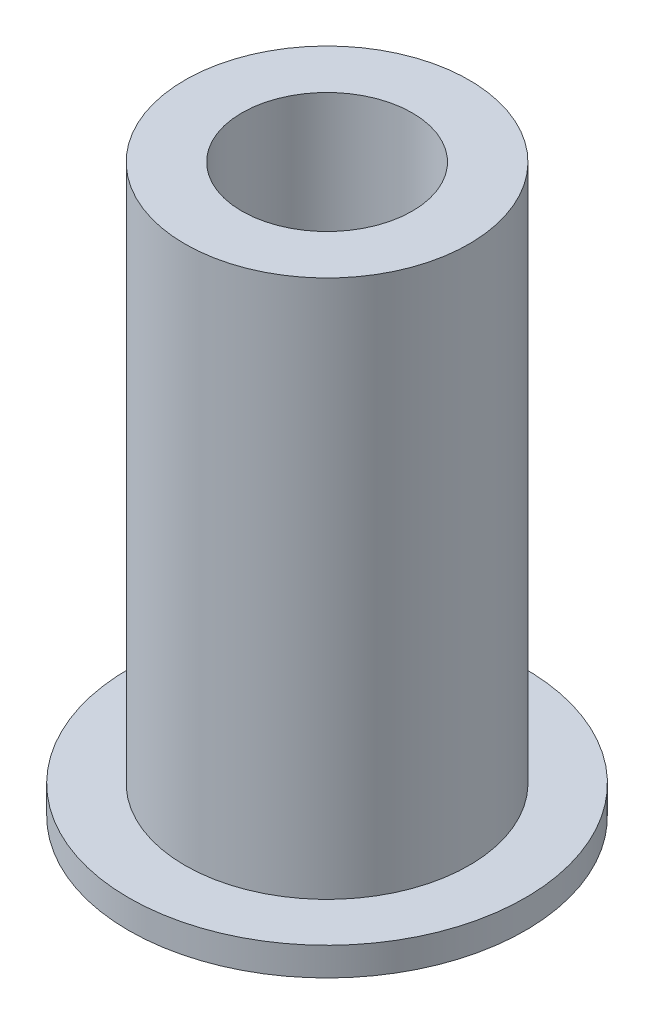
ISO-10303-21;
HEADER;
FILE_DESCRIPTION(('STEP AP214'),'2;1');
FILE_NAME('part.step','',(''),(''),'','','');
FILE_SCHEMA(('AUTOMOTIVE_DESIGN { 1 0 10303 214 1 1 1 1 }'));
ENDSEC;
DATA;
#1=APPLICATION_CONTEXT('core data for automotive mechanical design processes');
#2=APPLICATION_PROTOCOL_DEFINITION('international standard','automotive_design',2000,#1);
#3=PRODUCT_CONTEXT('',#1,'mechanical');
#4=PRODUCT('Part','Part','',(#3));
#5=PRODUCT_RELATED_PRODUCT_CATEGORY('part','',(#4));
#6=PRODUCT_DEFINITION_FORMATION('','',#4);
#7=PRODUCT_DEFINITION_CONTEXT('part definition',#1,'design');
#8=PRODUCT_DEFINITION('design','',#6,#7);
#9=PRODUCT_DEFINITION_SHAPE('','',#8);
#10=(LENGTH_UNIT() NAMED_UNIT(*) SI_UNIT(.MILLI.,.METRE.));
#11=(NAMED_UNIT(*) PLANE_ANGLE_UNIT() SI_UNIT($,.RADIAN.));
#12=(NAMED_UNIT(*) SI_UNIT($,.STERADIAN.) SOLID_ANGLE_UNIT());
#13=UNCERTAINTY_MEASURE_WITH_UNIT(LENGTH_MEASURE(1.E-05),#10,'distance_accuracy_value','');
#14=(GEOMETRIC_REPRESENTATION_CONTEXT(3) GLOBAL_UNCERTAINTY_ASSIGNED_CONTEXT((#13)) GLOBAL_UNIT_ASSIGNED_CONTEXT((#10,
#11,#12)) REPRESENTATION_CONTEXT('',''));
#15=CARTESIAN_POINT('',(0.,0.,0.));
#16=DIRECTION('',(0.,0.,1.));
#17=DIRECTION('',(1.,0.,0.));
#18=AXIS2_PLACEMENT_3D('',#15,#16,#17);
#19=CARTESIAN_POINT('',(0.,31.75,0.));
#20=DIRECTION('',(0.,1.,0.));
#21=DIRECTION('',(0.,0.,1.));
#22=AXIS2_PLACEMENT_3D('',#19,#20,#21);
#23=PLANE('',#22);
#24=CARTESIAN_POINT('',(0.,31.75,0.));
#25=DIRECTION('',(0.,1.,0.));
#26=DIRECTION('',(0.,0.,1.));
#27=AXIS2_PLACEMENT_3D('',#24,#25,#26);
#28=CIRCLE('',#27,7.9629);
#29=CARTESIAN_POINT('',(0.,31.75,7.9629));
#30=VERTEX_POINT('',#29);
#31=EDGE_CURVE('E10',#30,#30,#28,.T.);
#32=ORIENTED_EDGE('',*,*,#31,.T.);
#33=EDGE_LOOP('',(#32));
#34=FACE_BOUND('',#33,.T.);
#35=CARTESIAN_POINT('',(0.,31.75,0.));
#36=DIRECTION('',(0.,1.,0.));
#37=DIRECTION('',(0.,0.,1.));
#38=AXIS2_PLACEMENT_3D('',#35,#36,#37);
#39=CIRCLE('',#38,4.7752);
#40=CARTESIAN_POINT('',(0.,31.75,4.7752));
#41=VERTEX_POINT('',#40);
#42=EDGE_CURVE('E40',#41,#41,#39,.T.);
#43=ORIENTED_EDGE('',*,*,#42,.F.);
#44=EDGE_LOOP('',(#43));
#45=FACE_BOUND('',#44,.T.);
#46=ADVANCED_FACE('F33',(#34,#45),#23,.T.);
#47=CARTESIAN_POINT('',(0.,0.,0.));
#48=DIRECTION('',(0.,1.,0.));
#49=DIRECTION('',(0.,0.,1.));
#50=AXIS2_PLACEMENT_3D('',#47,#48,#49);
#51=PLANE('',#50);
#52=CARTESIAN_POINT('',(0.,0.,0.));
#53=DIRECTION('',(0.,1.,0.));
#54=DIRECTION('',(0.,0.,1.));
#55=AXIS2_PLACEMENT_3D('',#52,#53,#54);
#56=CIRCLE('',#55,4.7752);
#57=CARTESIAN_POINT('',(0.,0.,4.7752));
#58=VERTEX_POINT('',#57);
#59=EDGE_CURVE('E44',#58,#58,#56,.T.);
#60=ORIENTED_EDGE('',*,*,#59,.T.);
#61=EDGE_LOOP('',(#60));
#62=FACE_BOUND('',#61,.T.);
#63=CARTESIAN_POINT('',(0.,0.,0.));
#64=DIRECTION('',(0.,1.,0.));
#65=DIRECTION('',(0.,0.,1.));
#66=AXIS2_PLACEMENT_3D('',#63,#64,#65);
#67=CIRCLE('',#66,11.1125);
#68=CARTESIAN_POINT('',(0.,0.,11.1125));
#69=VERTEX_POINT('',#68);
#70=EDGE_CURVE('E51',#69,#69,#67,.T.);
#71=ORIENTED_EDGE('',*,*,#70,.F.);
#72=EDGE_LOOP('',(#71));
#73=FACE_BOUND('',#72,.T.);
#74=ADVANCED_FACE('F76',(#62,#73),#51,.F.);
#75=CARTESIAN_POINT('',(0.,31.75,0.));
#76=DIRECTION('',(0.,-1.,0.));
#77=DIRECTION('',(0.,0.,-1.));
#78=AXIS2_PLACEMENT_3D('',#75,#76,#77);
#79=CYLINDRICAL_SURFACE('',#78,7.9629);
#80=CARTESIAN_POINT('',(0.,1.5875,0.));
#81=DIRECTION('',(0.,1.,0.));
#82=DIRECTION('',(0.,0.,1.));
#83=AXIS2_PLACEMENT_3D('',#80,#81,#82);
#84=CIRCLE('',#83,7.9629);
#85=CARTESIAN_POINT('',(0.,1.5875,7.9629));
#86=VERTEX_POINT('',#85);
#87=EDGE_CURVE('E54',#86,#86,#84,.T.);
#88=ORIENTED_EDGE('',*,*,#87,.T.);
#89=EDGE_LOOP('',(#88));
#90=FACE_BOUND('',#89,.T.);
#91=ORIENTED_EDGE('',*,*,#31,.F.);
#92=EDGE_LOOP('',(#91));
#93=FACE_BOUND('',#92,.T.);
#94=ADVANCED_FACE('F35',(#90,#93),#79,.T.);
#95=CARTESIAN_POINT('',(0.,31.75,0.));
#96=DIRECTION('',(0.,-1.,0.));
#97=DIRECTION('',(0.,0.,-1.));
#98=AXIS2_PLACEMENT_3D('',#95,#96,#97);
#99=CYLINDRICAL_SURFACE('',#98,4.7752);
#100=ORIENTED_EDGE('',*,*,#42,.T.);
#101=EDGE_LOOP('',(#100));
#102=FACE_BOUND('',#101,.T.);
#103=ORIENTED_EDGE('',*,*,#59,.F.);
#104=EDGE_LOOP('',(#103));
#105=FACE_BOUND('',#104,.T.);
#106=ADVANCED_FACE('F65',(#102,#105),#99,.F.);
#107=CARTESIAN_POINT('',(0.,1.5875,0.));
#108=DIRECTION('',(0.,1.,0.));
#109=DIRECTION('',(0.,0.,1.));
#110=AXIS2_PLACEMENT_3D('',#107,#108,#109);
#111=PLANE('',#110);
#112=CARTESIAN_POINT('',(0.,1.5875,0.));
#113=DIRECTION('',(0.,1.,0.));
#114=DIRECTION('',(0.,0.,1.));
#115=AXIS2_PLACEMENT_3D('',#112,#113,#114);
#116=CIRCLE('',#115,11.1125);
#117=CARTESIAN_POINT('',(0.,1.5875,11.1125));
#118=VERTEX_POINT('',#117);
#119=EDGE_CURVE('E49',#118,#118,#116,.T.);
#120=ORIENTED_EDGE('',*,*,#119,.T.);
#121=EDGE_LOOP('',(#120));
#122=FACE_BOUND('',#121,.T.);
#123=ORIENTED_EDGE('',*,*,#87,.F.);
#124=EDGE_LOOP('',(#123));
#125=FACE_BOUND('',#124,.T.);
#126=ADVANCED_FACE('F62',(#122,#125),#111,.T.);
#127=CARTESIAN_POINT('',(0.,1.5875,0.));
#128=DIRECTION('',(0.,-1.,0.));
#129=DIRECTION('',(0.,0.,-1.));
#130=AXIS2_PLACEMENT_3D('',#127,#128,#129);
#131=CYLINDRICAL_SURFACE('',#130,11.1125);
#132=ORIENTED_EDGE('',*,*,#119,.F.);
#133=EDGE_LOOP('',(#132));
#134=FACE_BOUND('',#133,.T.);
#135=ORIENTED_EDGE('',*,*,#70,.T.);
#136=EDGE_LOOP('',(#135));
#137=FACE_BOUND('',#136,.T.);
#138=ADVANCED_FACE('F64',(#134,#137),#131,.T.);
#139=CLOSED_SHELL('',(#46,#74,#94,#106,#126,#138));
#140=MANIFOLD_SOLID_BREP('B2',#139);
#141=ADVANCED_BREP_SHAPE_REPRESENTATION('',(#18,#140),#14);
#142=SHAPE_DEFINITION_REPRESENTATION(#9,#141);
ENDSEC;
END-ISO-10303-21;
